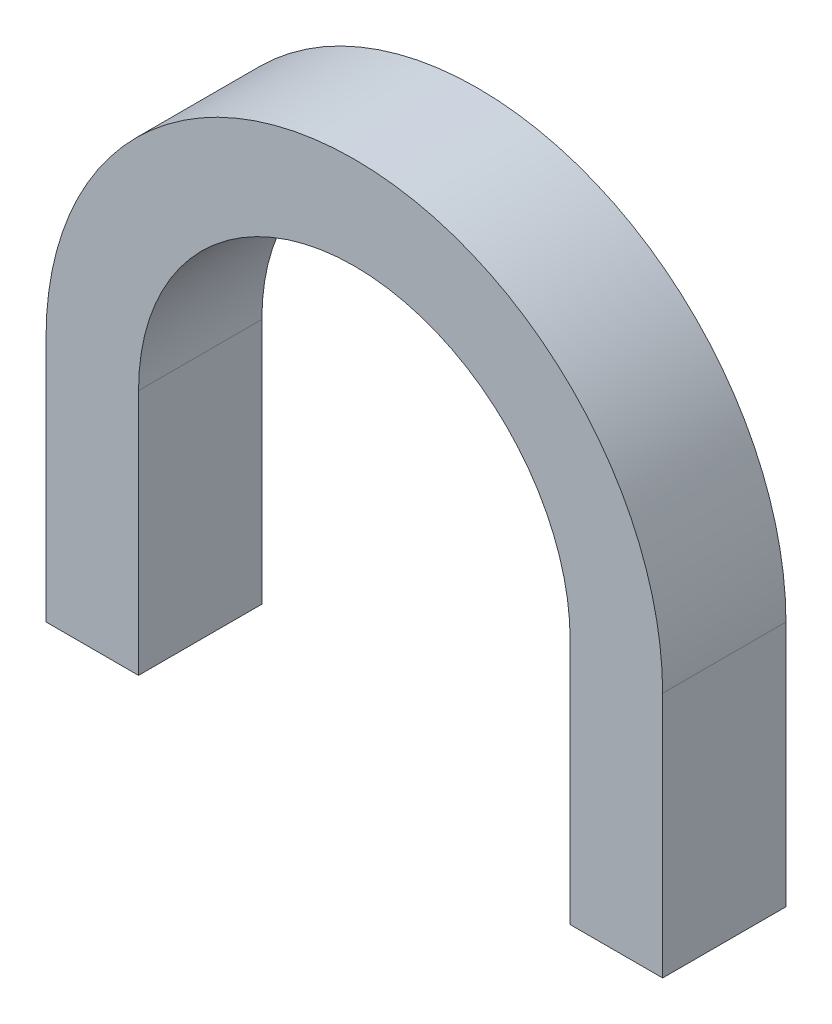
ISO-10303-21;
HEADER;
FILE_DESCRIPTION(('STEP AP214'),'2;1');
FILE_NAME('part.step','',(''),(''),'','','');
FILE_SCHEMA(('AUTOMOTIVE_DESIGN { 1 0 10303 214 1 1 1 1 }'));
ENDSEC;
DATA;
#1=APPLICATION_CONTEXT('core data for automotive mechanical design processes');
#2=APPLICATION_PROTOCOL_DEFINITION('international standard','automotive_design',2000,#1);
#3=PRODUCT_CONTEXT('',#1,'mechanical');
#4=PRODUCT('Part','Part','',(#3));
#5=PRODUCT_RELATED_PRODUCT_CATEGORY('part','',(#4));
#6=PRODUCT_DEFINITION_FORMATION('','',#4);
#7=PRODUCT_DEFINITION_CONTEXT('part definition',#1,'design');
#8=PRODUCT_DEFINITION('design','',#6,#7);
#9=PRODUCT_DEFINITION_SHAPE('','',#8);
#10=(LENGTH_UNIT() NAMED_UNIT(*) SI_UNIT(.MILLI.,.METRE.));
#11=(NAMED_UNIT(*) PLANE_ANGLE_UNIT() SI_UNIT($,.RADIAN.));
#12=(NAMED_UNIT(*) SI_UNIT($,.STERADIAN.) SOLID_ANGLE_UNIT());
#13=UNCERTAINTY_MEASURE_WITH_UNIT(LENGTH_MEASURE(1.E-05),#10,'distance_accuracy_value','');
#14=(GEOMETRIC_REPRESENTATION_CONTEXT(3) GLOBAL_UNCERTAINTY_ASSIGNED_CONTEXT((#13)) GLOBAL_UNIT_ASSIGNED_CONTEXT((#10,
#11,#12)) REPRESENTATION_CONTEXT('',''));
#15=CARTESIAN_POINT('',(0.,0.,0.));
#16=DIRECTION('',(0.,0.,1.));
#17=DIRECTION('',(1.,0.,0.));
#18=AXIS2_PLACEMENT_3D('',#15,#16,#17);
#19=CARTESIAN_POINT('',(-5.,0.,2.));
#20=DIRECTION('',(0.,1.,0.));
#21=DIRECTION('',(0.,0.,1.));
#22=AXIS2_PLACEMENT_3D('',#19,#20,#21);
#23=PLANE('',#22);
#24=DIRECTION('',(1.,0.,0.));
#25=VECTOR('',#24,1.);
#26=CARTESIAN_POINT('',(-5.,0.,0.));
#27=LINE('',#26,#25);
#28=CARTESIAN_POINT('',(-5.,0.,0.));
#29=VERTEX_POINT('',#28);
#30=CARTESIAN_POINT('',(-3.5,0.,0.));
#31=VERTEX_POINT('',#30);
#32=EDGE_CURVE('E140',#29,#31,#27,.T.);
#33=ORIENTED_EDGE('',*,*,#32,.T.);
#34=DIRECTION('',(0.,0.,-1.));
#35=VECTOR('',#34,1.);
#36=CARTESIAN_POINT('',(-3.5,0.,2.));
#37=LINE('',#36,#35);
#38=CARTESIAN_POINT('',(-3.5,0.,2.));
#39=VERTEX_POINT('',#38);
#40=EDGE_CURVE('E11',#39,#31,#37,.T.);
#41=ORIENTED_EDGE('',*,*,#40,.F.);
#42=DIRECTION('',(1.,0.,0.));
#43=VECTOR('',#42,1.);
#44=CARTESIAN_POINT('',(-5.,0.,2.));
#45=LINE('',#44,#43);
#46=CARTESIAN_POINT('',(-5.,0.,2.));
#47=VERTEX_POINT('',#46);
#48=EDGE_CURVE('E162',#47,#39,#45,.T.);
#49=ORIENTED_EDGE('',*,*,#48,.F.);
#50=DIRECTION('',(0.,0.,-1.));
#51=VECTOR('',#50,1.);
#52=CARTESIAN_POINT('',(-5.,0.,2.));
#53=LINE('',#52,#51);
#54=EDGE_CURVE('E136',#47,#29,#53,.T.);
#55=ORIENTED_EDGE('',*,*,#54,.T.);
#56=EDGE_LOOP('',(#33,#41,#49,#55));
#57=FACE_BOUND('',#56,.T.);
#58=ADVANCED_FACE('F39',(#57),#23,.F.);
#59=CARTESIAN_POINT('',(-3.5,0.,2.));
#60=DIRECTION('',(-1.,0.,0.));
#61=DIRECTION('',(0.,0.,1.));
#62=AXIS2_PLACEMENT_3D('',#59,#60,#61);
#63=PLANE('',#62);
#64=DIRECTION('',(0.,1.,0.));
#65=VECTOR('',#64,1.);
#66=CARTESIAN_POINT('',(-3.5,0.,0.));
#67=LINE('',#66,#65);
#68=CARTESIAN_POINT('',(-3.5,4.,0.));
#69=VERTEX_POINT('',#68);
#70=EDGE_CURVE('E144',#31,#69,#67,.T.);
#71=ORIENTED_EDGE('',*,*,#70,.T.);
#72=DIRECTION('',(0.,0.,-1.));
#73=VECTOR('',#72,1.);
#74=CARTESIAN_POINT('',(-3.5,4.,2.));
#75=LINE('',#74,#73);
#76=CARTESIAN_POINT('',(-3.5,4.,2.));
#77=VERTEX_POINT('',#76);
#78=EDGE_CURVE('E48',#77,#69,#75,.T.);
#79=ORIENTED_EDGE('',*,*,#78,.F.);
#80=DIRECTION('',(0.,1.,0.));
#81=VECTOR('',#80,1.);
#82=CARTESIAN_POINT('',(-3.5,0.,2.));
#83=LINE('',#82,#81);
#84=EDGE_CURVE('E99',#39,#77,#83,.T.);
#85=ORIENTED_EDGE('',*,*,#84,.F.);
#86=ORIENTED_EDGE('',*,*,#40,.T.);
#87=EDGE_LOOP('',(#71,#79,#85,#86));
#88=FACE_BOUND('',#87,.T.);
#89=ADVANCED_FACE('F208',(#88),#63,.F.);
#90=CARTESIAN_POINT('',(0.,4.,2.));
#91=DIRECTION('',(0.,0.,-1.));
#92=DIRECTION('',(-1.,0.,0.));
#93=AXIS2_PLACEMENT_3D('',#90,#91,#92);
#94=CYLINDRICAL_SURFACE('',#93,3.5);
#95=CARTESIAN_POINT('',(0.,4.,0.));
#96=DIRECTION('',(0.,0.,-1.));
#97=DIRECTION('',(-1.,0.,0.));
#98=AXIS2_PLACEMENT_3D('',#95,#96,#97);
#99=CIRCLE('',#98,3.5);
#100=CARTESIAN_POINT('',(3.5,4.,0.));
#101=VERTEX_POINT('',#100);
#102=EDGE_CURVE('E147',#69,#101,#99,.T.);
#103=ORIENTED_EDGE('',*,*,#102,.T.);
#104=DIRECTION('',(0.,0.,-1.));
#105=VECTOR('',#104,1.);
#106=CARTESIAN_POINT('',(3.5,4.,2.));
#107=LINE('',#106,#105);
#108=CARTESIAN_POINT('',(3.5,4.,2.));
#109=VERTEX_POINT('',#108);
#110=EDGE_CURVE('E173',#109,#101,#107,.T.);
#111=ORIENTED_EDGE('',*,*,#110,.F.);
#112=CARTESIAN_POINT('',(0.,4.,2.));
#113=DIRECTION('',(0.,0.,-1.));
#114=DIRECTION('',(-1.,0.,0.));
#115=AXIS2_PLACEMENT_3D('',#112,#113,#114);
#116=CIRCLE('',#115,3.5);
#117=EDGE_CURVE('E183',#77,#109,#116,.T.);
#118=ORIENTED_EDGE('',*,*,#117,.F.);
#119=ORIENTED_EDGE('',*,*,#78,.T.);
#120=EDGE_LOOP('',(#103,#111,#118,#119));
#121=FACE_BOUND('',#120,.T.);
#122=ADVANCED_FACE('F181',(#121),#94,.F.);
#123=CARTESIAN_POINT('',(3.5,4.,2.));
#124=DIRECTION('',(1.,0.,0.));
#125=DIRECTION('',(0.,0.,-1.));
#126=AXIS2_PLACEMENT_3D('',#123,#124,#125);
#127=PLANE('',#126);
#128=DIRECTION('',(0.,-1.,0.));
#129=VECTOR('',#128,1.);
#130=CARTESIAN_POINT('',(3.5,4.,0.));
#131=LINE('',#130,#129);
#132=CARTESIAN_POINT('',(3.5,0.,0.));
#133=VERTEX_POINT('',#132);
#134=EDGE_CURVE('E150',#101,#133,#131,.T.);
#135=ORIENTED_EDGE('',*,*,#134,.T.);
#136=DIRECTION('',(0.,0.,-1.));
#137=VECTOR('',#136,1.);
#138=CARTESIAN_POINT('',(3.5,0.,2.));
#139=LINE('',#138,#137);
#140=CARTESIAN_POINT('',(3.5,0.,2.));
#141=VERTEX_POINT('',#140);
#142=EDGE_CURVE('E169',#141,#133,#139,.T.);
#143=ORIENTED_EDGE('',*,*,#142,.F.);
#144=DIRECTION('',(0.,-1.,0.));
#145=VECTOR('',#144,1.);
#146=CARTESIAN_POINT('',(3.5,4.,2.));
#147=LINE('',#146,#145);
#148=EDGE_CURVE('E196',#109,#141,#147,.T.);
#149=ORIENTED_EDGE('',*,*,#148,.F.);
#150=ORIENTED_EDGE('',*,*,#110,.T.);
#151=EDGE_LOOP('',(#135,#143,#149,#150));
#152=FACE_BOUND('',#151,.T.);
#153=ADVANCED_FACE('F191',(#152),#127,.F.);
#154=CARTESIAN_POINT('',(3.5,0.,2.));
#155=DIRECTION('',(0.,1.,0.));
#156=DIRECTION('',(0.,0.,1.));
#157=AXIS2_PLACEMENT_3D('',#154,#155,#156);
#158=PLANE('',#157);
#159=DIRECTION('',(1.,0.,0.));
#160=VECTOR('',#159,1.);
#161=CARTESIAN_POINT('',(3.5,0.,0.));
#162=LINE('',#161,#160);
#163=CARTESIAN_POINT('',(5.,0.,0.));
#164=VERTEX_POINT('',#163);
#165=EDGE_CURVE('E153',#133,#164,#162,.T.);
#166=ORIENTED_EDGE('',*,*,#165,.T.);
#167=DIRECTION('',(0.,0.,-1.));
#168=VECTOR('',#167,1.);
#169=CARTESIAN_POINT('',(5.,0.,2.));
#170=LINE('',#169,#168);
#171=CARTESIAN_POINT('',(5.,0.,2.));
#172=VERTEX_POINT('',#171);
#173=EDGE_CURVE('E129',#172,#164,#170,.T.);
#174=ORIENTED_EDGE('',*,*,#173,.F.);
#175=DIRECTION('',(1.,0.,0.));
#176=VECTOR('',#175,1.);
#177=CARTESIAN_POINT('',(3.5,0.,2.));
#178=LINE('',#177,#176);
#179=EDGE_CURVE('E118',#141,#172,#178,.T.);
#180=ORIENTED_EDGE('',*,*,#179,.F.);
#181=ORIENTED_EDGE('',*,*,#142,.T.);
#182=EDGE_LOOP('',(#166,#174,#180,#181));
#183=FACE_BOUND('',#182,.T.);
#184=ADVANCED_FACE('F194',(#183),#158,.F.);
#185=CARTESIAN_POINT('',(5.,4.,2.));
#186=DIRECTION('',(-1.,0.,0.));
#187=DIRECTION('',(0.,0.,1.));
#188=AXIS2_PLACEMENT_3D('',#185,#186,#187);
#189=PLANE('',#188);
#190=DIRECTION('',(0.,1.,0.));
#191=VECTOR('',#190,1.);
#192=CARTESIAN_POINT('',(5.,4.,0.));
#193=LINE('',#192,#191);
#194=CARTESIAN_POINT('',(5.,4.,0.));
#195=VERTEX_POINT('',#194);
#196=EDGE_CURVE('E127',#164,#195,#193,.T.);
#197=ORIENTED_EDGE('',*,*,#196,.T.);
#198=DIRECTION('',(0.,0.,-1.));
#199=VECTOR('',#198,1.);
#200=CARTESIAN_POINT('',(5.,4.,2.));
#201=LINE('',#200,#199);
#202=CARTESIAN_POINT('',(5.,4.,2.));
#203=VERTEX_POINT('',#202);
#204=EDGE_CURVE('E124',#203,#195,#201,.T.);
#205=ORIENTED_EDGE('',*,*,#204,.F.);
#206=DIRECTION('',(0.,1.,0.));
#207=VECTOR('',#206,1.);
#208=CARTESIAN_POINT('',(5.,4.,2.));
#209=LINE('',#208,#207);
#210=EDGE_CURVE('E112',#172,#203,#209,.T.);
#211=ORIENTED_EDGE('',*,*,#210,.F.);
#212=ORIENTED_EDGE('',*,*,#173,.T.);
#213=EDGE_LOOP('',(#197,#205,#211,#212));
#214=FACE_BOUND('',#213,.T.);
#215=ADVANCED_FACE('F125',(#214),#189,.F.);
#216=CARTESIAN_POINT('',(0.,4.,2.));
#217=DIRECTION('',(0.,0.,-1.));
#218=DIRECTION('',(-1.,0.,0.));
#219=AXIS2_PLACEMENT_3D('',#216,#217,#218);
#220=CYLINDRICAL_SURFACE('',#219,5.);
#221=CARTESIAN_POINT('',(0.,4.,0.));
#222=DIRECTION('',(0.,0.,1.));
#223=DIRECTION('',(-1.,0.,0.));
#224=AXIS2_PLACEMENT_3D('',#221,#222,#223);
#225=CIRCLE('',#224,5.);
#226=CARTESIAN_POINT('',(-5.,4.,0.));
#227=VERTEX_POINT('',#226);
#228=EDGE_CURVE('E85',#195,#227,#225,.T.);
#229=ORIENTED_EDGE('',*,*,#228,.T.);
#230=DIRECTION('',(0.,0.,-1.));
#231=VECTOR('',#230,1.);
#232=CARTESIAN_POINT('',(-5.,4.,2.));
#233=LINE('',#232,#231);
#234=CARTESIAN_POINT('',(-5.,4.,2.));
#235=VERTEX_POINT('',#234);
#236=EDGE_CURVE('E130',#235,#227,#233,.T.);
#237=ORIENTED_EDGE('',*,*,#236,.F.);
#238=CARTESIAN_POINT('',(0.,4.,2.));
#239=DIRECTION('',(0.,0.,1.));
#240=DIRECTION('',(-1.,0.,0.));
#241=AXIS2_PLACEMENT_3D('',#238,#239,#240);
#242=CIRCLE('',#241,5.);
#243=EDGE_CURVE('E116',#203,#235,#242,.T.);
#244=ORIENTED_EDGE('',*,*,#243,.F.);
#245=ORIENTED_EDGE('',*,*,#204,.T.);
#246=EDGE_LOOP('',(#229,#237,#244,#245));
#247=FACE_BOUND('',#246,.T.);
#248=ADVANCED_FACE('F132',(#247),#220,.T.);
#249=CARTESIAN_POINT('',(-5.,0.,2.));
#250=DIRECTION('',(1.,0.,0.));
#251=DIRECTION('',(0.,0.,-1.));
#252=AXIS2_PLACEMENT_3D('',#249,#250,#251);
#253=PLANE('',#252);
#254=DIRECTION('',(0.,-1.,0.));
#255=VECTOR('',#254,1.);
#256=CARTESIAN_POINT('',(-5.,0.,0.));
#257=LINE('',#256,#255);
#258=EDGE_CURVE('E91',#227,#29,#257,.T.);
#259=ORIENTED_EDGE('',*,*,#258,.T.);
#260=ORIENTED_EDGE('',*,*,#54,.F.);
#261=DIRECTION('',(0.,-1.,0.));
#262=VECTOR('',#261,1.);
#263=CARTESIAN_POINT('',(-5.,0.,2.));
#264=LINE('',#263,#262);
#265=EDGE_CURVE('E56',#235,#47,#264,.T.);
#266=ORIENTED_EDGE('',*,*,#265,.F.);
#267=ORIENTED_EDGE('',*,*,#236,.T.);
#268=EDGE_LOOP('',(#259,#260,#266,#267));
#269=FACE_BOUND('',#268,.T.);
#270=ADVANCED_FACE('F224',(#269),#253,.F.);
#271=CARTESIAN_POINT('',(0.,4.,2.));
#272=DIRECTION('',(0.,0.,-1.));
#273=DIRECTION('',(-1.,0.,0.));
#274=AXIS2_PLACEMENT_3D('',#271,#272,#273);
#275=PLANE('',#274);
#276=ORIENTED_EDGE('',*,*,#48,.T.);
#277=ORIENTED_EDGE('',*,*,#84,.T.);
#278=ORIENTED_EDGE('',*,*,#117,.T.);
#279=ORIENTED_EDGE('',*,*,#148,.T.);
#280=ORIENTED_EDGE('',*,*,#179,.T.);
#281=ORIENTED_EDGE('',*,*,#210,.T.);
#282=ORIENTED_EDGE('',*,*,#243,.T.);
#283=ORIENTED_EDGE('',*,*,#265,.T.);
#284=EDGE_LOOP('',(#276,#277,#278,#279,#280,#281,#282,#283));
#285=FACE_BOUND('',#284,.T.);
#286=ADVANCED_FACE('F114',(#285),#275,.F.);
#287=CARTESIAN_POINT('',(0.,4.,0.));
#288=DIRECTION('',(0.,0.,-1.));
#289=DIRECTION('',(-1.,0.,0.));
#290=AXIS2_PLACEMENT_3D('',#287,#288,#289);
#291=PLANE('',#290);
#292=ORIENTED_EDGE('',*,*,#32,.F.);
#293=ORIENTED_EDGE('',*,*,#258,.F.);
#294=ORIENTED_EDGE('',*,*,#228,.F.);
#295=ORIENTED_EDGE('',*,*,#196,.F.);
#296=ORIENTED_EDGE('',*,*,#165,.F.);
#297=ORIENTED_EDGE('',*,*,#134,.F.);
#298=ORIENTED_EDGE('',*,*,#102,.F.);
#299=ORIENTED_EDGE('',*,*,#70,.F.);
#300=EDGE_LOOP('',(#292,#293,#294,#295,#296,#297,#298,#299));
#301=FACE_BOUND('',#300,.T.);
#302=ADVANCED_FACE('F187',(#301),#291,.T.);
#303=CLOSED_SHELL('',(#58,#89,#122,#153,#184,#215,#248,#270,#286,#302));
#304=MANIFOLD_SOLID_BREP('B2',#303);
#305=ADVANCED_BREP_SHAPE_REPRESENTATION('',(#18,#304),#14);
#306=SHAPE_DEFINITION_REPRESENTATION(#9,#305);
ENDSEC;
END-ISO-10303-21;
